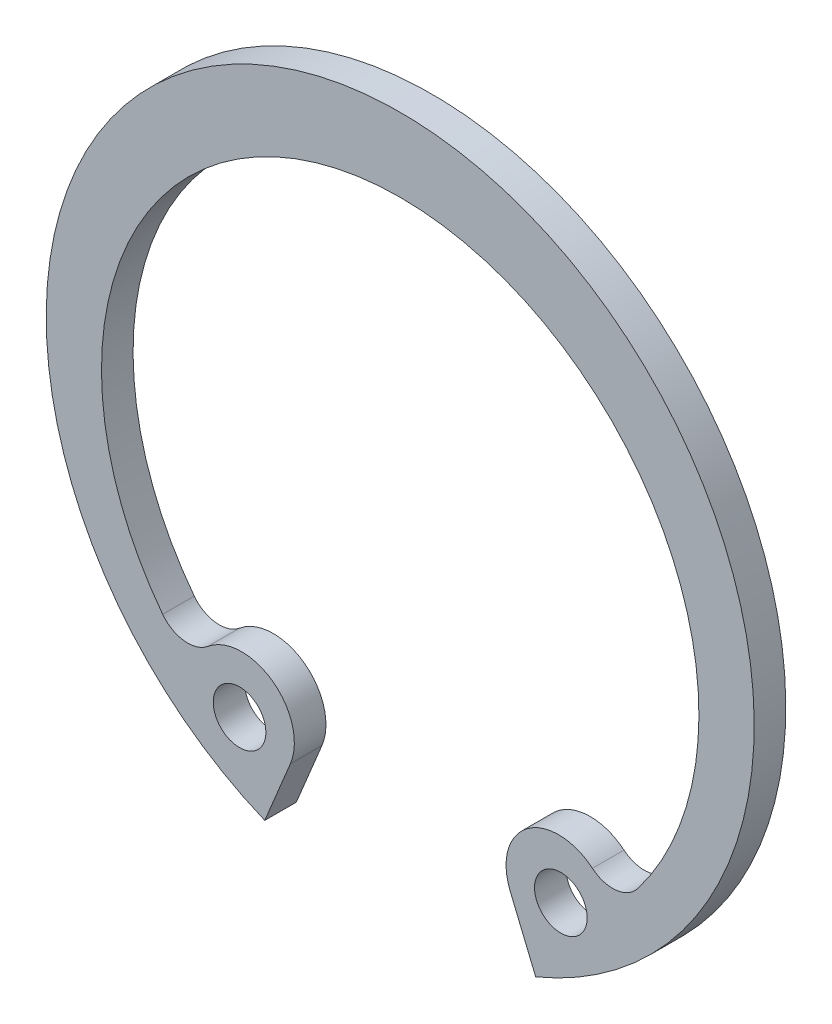
ISO-10303-21;
HEADER;
FILE_DESCRIPTION(('STEP AP214'),'2;1');
FILE_NAME('part.step','',(''),(''),'','','');
FILE_SCHEMA(('AUTOMOTIVE_DESIGN { 1 0 10303 214 1 1 1 1 }'));
ENDSEC;
DATA;
#1=APPLICATION_CONTEXT('core data for automotive mechanical design processes');
#2=APPLICATION_PROTOCOL_DEFINITION('international standard','automotive_design',2000,#1);
#3=PRODUCT_CONTEXT('',#1,'mechanical');
#4=PRODUCT('Part','Part','',(#3));
#5=PRODUCT_RELATED_PRODUCT_CATEGORY('part','',(#4));
#6=PRODUCT_DEFINITION_FORMATION('','',#4);
#7=PRODUCT_DEFINITION_CONTEXT('part definition',#1,'design');
#8=PRODUCT_DEFINITION('design','',#6,#7);
#9=PRODUCT_DEFINITION_SHAPE('','',#8);
#10=(LENGTH_UNIT() NAMED_UNIT(*) SI_UNIT(.MILLI.,.METRE.));
#11=(NAMED_UNIT(*) PLANE_ANGLE_UNIT() SI_UNIT($,.RADIAN.));
#12=(NAMED_UNIT(*) SI_UNIT($,.STERADIAN.) SOLID_ANGLE_UNIT());
#13=UNCERTAINTY_MEASURE_WITH_UNIT(LENGTH_MEASURE(1.E-05),#10,'distance_accuracy_value','');
#14=(GEOMETRIC_REPRESENTATION_CONTEXT(3) GLOBAL_UNCERTAINTY_ASSIGNED_CONTEXT((#13)) GLOBAL_UNIT_ASSIGNED_CONTEXT((#10,
#11,#12)) REPRESENTATION_CONTEXT('',''));
#15=CARTESIAN_POINT('',(0.,0.,0.));
#16=DIRECTION('',(0.,0.,1.));
#17=DIRECTION('',(1.,0.,0.));
#18=AXIS2_PLACEMENT_3D('',#15,#16,#17);
#19=CARTESIAN_POINT('',(-6.02213372534577,-9.31246505464869,1.2));
#20=DIRECTION('',(0.,0.,1.));
#21=DIRECTION('',(1.,0.,0.));
#22=AXIS2_PLACEMENT_3D('',#19,#20,#21);
#23=PLANE('',#22);
#24=CARTESIAN_POINT('',(-6.1038113576428,-9.5096523022827,1.2));
#25=DIRECTION('',(0.,0.,1.));
#26=DIRECTION('',(1.,0.,0.));
#27=AXIS2_PLACEMENT_3D('',#24,#25,#26);
#28=CIRCLE('',#27,1.);
#29=CARTESIAN_POINT('',(-5.1038113576428,-9.5096523022827,1.2));
#30=VERTEX_POINT('',#29);
#31=EDGE_CURVE('E142',#30,#30,#28,.T.);
#32=ORIENTED_EDGE('',*,*,#31,.F.);
#33=EDGE_LOOP('',(#32));
#34=FACE_BOUND('',#33,.T.);
#35=CARTESIAN_POINT('',(-6.02213372534577,-9.31246505464869,1.2));
#36=DIRECTION('',(0.,0.,1.));
#37=DIRECTION('',(1.,0.,0.));
#38=AXIS2_PLACEMENT_3D('',#35,#36,#37);
#39=CIRCLE('',#38,1.99999999999999);
#40=CARTESIAN_POINT('',(-4.17437466032321,-10.0778319193789,1.2));
#41=VERTEX_POINT('',#40);
#42=CARTESIAN_POINT('',(-7.30279298064297,-7.77626458862168,1.2));
#43=VERTEX_POINT('',#42);
#44=EDGE_CURVE('E155',#41,#43,#39,.T.);
#45=ORIENTED_EDGE('',*,*,#44,.T.);
#46=CARTESIAN_POINT('',(-8.07118853382129,-6.85454430900547,1.2));
#47=DIRECTION('',(0.,0.,-1.));
#48=DIRECTION('',(-1.,0.,0.));
#49=AXIS2_PLACEMENT_3D('',#46,#47,#48);
#50=CIRCLE('',#49,1.2);
#51=CARTESIAN_POINT('',(-9.02541772008587,-7.58217516327213,1.2));
#52=VERTEX_POINT('',#51);
#53=EDGE_CURVE('E101',#43,#52,#50,.T.);
#54=ORIENTED_EDGE('',*,*,#53,.T.);
#55=CARTESIAN_POINT('',(0.,-0.7,1.2));
#56=DIRECTION('',(0.,0.,-1.));
#57=DIRECTION('',(1.,0.,0.));
#58=AXIS2_PLACEMENT_3D('',#55,#56,#57);
#59=CIRCLE('',#58,11.35);
#60=CARTESIAN_POINT('',(9.02541772008588,-7.58217516327213,1.2));
#61=VERTEX_POINT('',#60);
#62=EDGE_CURVE('E170',#52,#61,#59,.T.);
#63=ORIENTED_EDGE('',*,*,#62,.T.);
#64=CARTESIAN_POINT('',(8.0711885338213,-6.85454430900547,1.2));
#65=DIRECTION('',(0.,0.,-1.));
#66=DIRECTION('',(1.,0.,0.));
#67=AXIS2_PLACEMENT_3D('',#64,#65,#66);
#68=CIRCLE('',#67,1.2);
#69=CARTESIAN_POINT('',(7.30279298064297,-7.77626458862168,1.2));
#70=VERTEX_POINT('',#69);
#71=EDGE_CURVE('E183',#61,#70,#68,.T.);
#72=ORIENTED_EDGE('',*,*,#71,.T.);
#73=CARTESIAN_POINT('',(6.02213372534578,-9.31246505464869,1.2));
#74=DIRECTION('',(0.,0.,1.));
#75=DIRECTION('',(-1.,0.,0.));
#76=AXIS2_PLACEMENT_3D('',#73,#74,#75);
#77=CIRCLE('',#76,1.99999999999999);
#78=CARTESIAN_POINT('',(4.17437466032322,-10.0778319193789,1.2));
#79=VERTEX_POINT('',#78);
#80=EDGE_CURVE('E120',#70,#79,#77,.T.);
#81=ORIENTED_EDGE('',*,*,#80,.T.);
#82=DIRECTION('',(0.382683432365096,-0.923879532511284,0.));
#83=VECTOR('',#82,1.);
#84=CARTESIAN_POINT('',(4.17437466032322,-10.0778319193789,1.2));
#85=LINE('',#84,#83);
#86=CARTESIAN_POINT('',(5.14709216531048,-12.4261797122768,1.2));
#87=VERTEX_POINT('',#86);
#88=EDGE_CURVE('E114',#79,#87,#85,.T.);
#89=ORIENTED_EDGE('',*,*,#88,.T.);
#90=CARTESIAN_POINT('',(0.,0.,1.2));
#91=DIRECTION('',(0.,0.,1.));
#92=DIRECTION('',(1.,0.,0.));
#93=AXIS2_PLACEMENT_3D('',#90,#91,#92);
#94=CIRCLE('',#93,13.45);
#95=CARTESIAN_POINT('',(-5.14709216531047,-12.4261797122768,1.2));
#96=VERTEX_POINT('',#95);
#97=EDGE_CURVE('E118',#87,#96,#94,.T.);
#98=ORIENTED_EDGE('',*,*,#97,.T.);
#99=DIRECTION('',(0.382683432365091,0.923879532511286,0.));
#100=VECTOR('',#99,1.);
#101=CARTESIAN_POINT('',(-4.17437466032321,-10.0778319193789,1.2));
#102=LINE('',#101,#100);
#103=EDGE_CURVE('E58',#96,#41,#102,.T.);
#104=ORIENTED_EDGE('',*,*,#103,.T.);
#105=EDGE_LOOP('',(#45,#54,#63,#72,#81,#89,#98,#104));
#106=FACE_BOUND('',#105,.T.);
#107=CARTESIAN_POINT('',(6.10381135764281,-9.5096523022827,1.2));
#108=DIRECTION('',(0.,0.,1.));
#109=DIRECTION('',(-1.,0.,0.));
#110=AXIS2_PLACEMENT_3D('',#107,#108,#109);
#111=CIRCLE('',#110,1.);
#112=CARTESIAN_POINT('',(5.10381135764281,-9.5096523022827,1.2));
#113=VERTEX_POINT('',#112);
#114=EDGE_CURVE('E193',#113,#113,#111,.T.);
#115=ORIENTED_EDGE('',*,*,#114,.F.);
#116=EDGE_LOOP('',(#115));
#117=FACE_BOUND('',#116,.T.);
#118=ADVANCED_FACE('F41',(#34,#106,#117),#23,.T.);
#119=CARTESIAN_POINT('',(-6.02213372534577,-9.31246505464869,0.));
#120=DIRECTION('',(0.,0.,1.));
#121=DIRECTION('',(1.,0.,0.));
#122=AXIS2_PLACEMENT_3D('',#119,#120,#121);
#123=PLANE('',#122);
#124=CARTESIAN_POINT('',(-6.02213372534577,-9.31246505464869,0.));
#125=DIRECTION('',(0.,0.,1.));
#126=DIRECTION('',(1.,0.,0.));
#127=AXIS2_PLACEMENT_3D('',#124,#125,#126);
#128=CIRCLE('',#127,1.99999999999999);
#129=CARTESIAN_POINT('',(-4.17437466032321,-10.0778319193789,0.));
#130=VERTEX_POINT('',#129);
#131=CARTESIAN_POINT('',(-7.30279298064297,-7.77626458862168,0.));
#132=VERTEX_POINT('',#131);
#133=EDGE_CURVE('E138',#130,#132,#128,.T.);
#134=ORIENTED_EDGE('',*,*,#133,.F.);
#135=DIRECTION('',(0.382683432365091,0.923879532511286,0.));
#136=VECTOR('',#135,1.);
#137=CARTESIAN_POINT('',(-4.17437466032321,-10.0778319193789,0.));
#138=LINE('',#137,#136);
#139=CARTESIAN_POINT('',(-5.14709216531047,-12.4261797122768,0.));
#140=VERTEX_POINT('',#139);
#141=EDGE_CURVE('E93',#140,#130,#138,.T.);
#142=ORIENTED_EDGE('',*,*,#141,.F.);
#143=CARTESIAN_POINT('',(0.,0.,0.));
#144=DIRECTION('',(0.,0.,1.));
#145=DIRECTION('',(1.,0.,0.));
#146=AXIS2_PLACEMENT_3D('',#143,#144,#145);
#147=CIRCLE('',#146,13.45);
#148=CARTESIAN_POINT('',(5.14709216531048,-12.4261797122768,0.));
#149=VERTEX_POINT('',#148);
#150=EDGE_CURVE('E87',#149,#140,#147,.T.);
#151=ORIENTED_EDGE('',*,*,#150,.F.);
#152=DIRECTION('',(0.382683432365096,-0.923879532511284,0.));
#153=VECTOR('',#152,1.);
#154=CARTESIAN_POINT('',(4.17437466032322,-10.0778319193789,0.));
#155=LINE('',#154,#153);
#156=CARTESIAN_POINT('',(4.17437466032322,-10.0778319193789,0.));
#157=VERTEX_POINT('',#156);
#158=EDGE_CURVE('E128',#157,#149,#155,.T.);
#159=ORIENTED_EDGE('',*,*,#158,.F.);
#160=CARTESIAN_POINT('',(6.02213372534578,-9.31246505464869,0.));
#161=DIRECTION('',(0.,0.,1.));
#162=DIRECTION('',(-1.,0.,0.));
#163=AXIS2_PLACEMENT_3D('',#160,#161,#162);
#164=CIRCLE('',#163,1.99999999999999);
#165=CARTESIAN_POINT('',(7.30279298064297,-7.77626458862168,0.));
#166=VERTEX_POINT('',#165);
#167=EDGE_CURVE('E149',#166,#157,#164,.T.);
#168=ORIENTED_EDGE('',*,*,#167,.F.);
#169=CARTESIAN_POINT('',(8.0711885338213,-6.85454430900547,0.));
#170=DIRECTION('',(0.,0.,-1.));
#171=DIRECTION('',(1.,0.,0.));
#172=AXIS2_PLACEMENT_3D('',#169,#170,#171);
#173=CIRCLE('',#172,1.2);
#174=CARTESIAN_POINT('',(9.02541772008588,-7.58217516327213,0.));
#175=VERTEX_POINT('',#174);
#176=EDGE_CURVE('E147',#175,#166,#173,.T.);
#177=ORIENTED_EDGE('',*,*,#176,.F.);
#178=CARTESIAN_POINT('',(0.,-0.7,0.));
#179=DIRECTION('',(0.,0.,-1.));
#180=DIRECTION('',(1.,0.,0.));
#181=AXIS2_PLACEMENT_3D('',#178,#179,#180);
#182=CIRCLE('',#181,11.35);
#183=CARTESIAN_POINT('',(-9.02541772008587,-7.58217516327213,0.));
#184=VERTEX_POINT('',#183);
#185=EDGE_CURVE('E144',#184,#175,#182,.T.);
#186=ORIENTED_EDGE('',*,*,#185,.F.);
#187=CARTESIAN_POINT('',(-8.07118853382129,-6.85454430900547,0.));
#188=DIRECTION('',(0.,0.,-1.));
#189=DIRECTION('',(-1.,0.,0.));
#190=AXIS2_PLACEMENT_3D('',#187,#188,#189);
#191=CIRCLE('',#190,1.2);
#192=EDGE_CURVE('E141',#132,#184,#191,.T.);
#193=ORIENTED_EDGE('',*,*,#192,.F.);
#194=EDGE_LOOP('',(#134,#142,#151,#159,#168,#177,#186,#193));
#195=FACE_BOUND('',#194,.T.);
#196=CARTESIAN_POINT('',(-6.1038113576428,-9.5096523022827,0.));
#197=DIRECTION('',(0.,0.,1.));
#198=DIRECTION('',(1.,0.,0.));
#199=AXIS2_PLACEMENT_3D('',#196,#197,#198);
#200=CIRCLE('',#199,1.);
#201=CARTESIAN_POINT('',(-5.1038113576428,-9.5096523022827,0.));
#202=VERTEX_POINT('',#201);
#203=EDGE_CURVE('E190',#202,#202,#200,.T.);
#204=ORIENTED_EDGE('',*,*,#203,.T.);
#205=EDGE_LOOP('',(#204));
#206=FACE_BOUND('',#205,.T.);
#207=CARTESIAN_POINT('',(6.10381135764281,-9.5096523022827,0.));
#208=DIRECTION('',(0.,0.,1.));
#209=DIRECTION('',(-1.,0.,0.));
#210=AXIS2_PLACEMENT_3D('',#207,#208,#209);
#211=CIRCLE('',#210,1.);
#212=CARTESIAN_POINT('',(5.10381135764281,-9.5096523022827,0.));
#213=VERTEX_POINT('',#212);
#214=EDGE_CURVE('E196',#213,#213,#211,.T.);
#215=ORIENTED_EDGE('',*,*,#214,.T.);
#216=EDGE_LOOP('',(#215));
#217=FACE_BOUND('',#216,.T.);
#218=ADVANCED_FACE('F174',(#195,#206,#217),#123,.F.);
#219=CARTESIAN_POINT('',(-6.02213372534577,-9.31246505464869,1.2));
#220=DIRECTION('',(0.,0.,-1.));
#221=DIRECTION('',(-1.,0.,0.));
#222=AXIS2_PLACEMENT_3D('',#219,#220,#221);
#223=CYLINDRICAL_SURFACE('',#222,1.99999999999999);
#224=ORIENTED_EDGE('',*,*,#133,.T.);
#225=DIRECTION('',(0.,0.,-1.));
#226=VECTOR('',#225,1.);
#227=CARTESIAN_POINT('',(-7.30279298064297,-7.77626458862168,1.2));
#228=LINE('',#227,#226);
#229=EDGE_CURVE('E11',#43,#132,#228,.T.);
#230=ORIENTED_EDGE('',*,*,#229,.F.);
#231=ORIENTED_EDGE('',*,*,#44,.F.);
#232=DIRECTION('',(0.,0.,-1.));
#233=VECTOR('',#232,1.);
#234=CARTESIAN_POINT('',(-4.17437466032321,-10.0778319193789,1.2));
#235=LINE('',#234,#233);
#236=EDGE_CURVE('E134',#41,#130,#235,.T.);
#237=ORIENTED_EDGE('',*,*,#236,.T.);
#238=EDGE_LOOP('',(#224,#230,#231,#237));
#239=FACE_BOUND('',#238,.T.);
#240=ADVANCED_FACE('F43',(#239),#223,.T.);
#241=CARTESIAN_POINT('',(-8.07118853382129,-6.85454430900547,1.2));
#242=DIRECTION('',(0.,0.,-1.));
#243=DIRECTION('',(-1.,0.,0.));
#244=AXIS2_PLACEMENT_3D('',#241,#242,#243);
#245=CYLINDRICAL_SURFACE('',#244,1.2);
#246=ORIENTED_EDGE('',*,*,#192,.T.);
#247=DIRECTION('',(0.,0.,-1.));
#248=VECTOR('',#247,1.);
#249=CARTESIAN_POINT('',(-9.02541772008587,-7.58217516327213,1.2));
#250=LINE('',#249,#248);
#251=EDGE_CURVE('E50',#52,#184,#250,.T.);
#252=ORIENTED_EDGE('',*,*,#251,.F.);
#253=ORIENTED_EDGE('',*,*,#53,.F.);
#254=ORIENTED_EDGE('',*,*,#229,.T.);
#255=EDGE_LOOP('',(#246,#252,#253,#254));
#256=FACE_BOUND('',#255,.T.);
#257=ADVANCED_FACE('F228',(#256),#245,.F.);
#258=CARTESIAN_POINT('',(0.,-0.7,1.2));
#259=DIRECTION('',(0.,0.,-1.));
#260=DIRECTION('',(-1.,0.,0.));
#261=AXIS2_PLACEMENT_3D('',#258,#259,#260);
#262=CYLINDRICAL_SURFACE('',#261,11.35);
#263=ORIENTED_EDGE('',*,*,#185,.T.);
#264=DIRECTION('',(0.,0.,-1.));
#265=VECTOR('',#264,1.);
#266=CARTESIAN_POINT('',(9.02541772008588,-7.58217516327213,1.2));
#267=LINE('',#266,#265);
#268=EDGE_CURVE('E162',#61,#175,#267,.T.);
#269=ORIENTED_EDGE('',*,*,#268,.F.);
#270=ORIENTED_EDGE('',*,*,#62,.F.);
#271=ORIENTED_EDGE('',*,*,#251,.T.);
#272=EDGE_LOOP('',(#263,#269,#270,#271));
#273=FACE_BOUND('',#272,.T.);
#274=ADVANCED_FACE('F168',(#273),#262,.F.);
#275=CARTESIAN_POINT('',(8.0711885338213,-6.85454430900547,1.2));
#276=DIRECTION('',(0.,0.,-1.));
#277=DIRECTION('',(-1.,0.,0.));
#278=AXIS2_PLACEMENT_3D('',#275,#276,#277);
#279=CYLINDRICAL_SURFACE('',#278,1.2);
#280=ORIENTED_EDGE('',*,*,#176,.T.);
#281=DIRECTION('',(0.,0.,-1.));
#282=VECTOR('',#281,1.);
#283=CARTESIAN_POINT('',(7.30279298064297,-7.77626458862168,1.2));
#284=LINE('',#283,#282);
#285=EDGE_CURVE('E159',#70,#166,#284,.T.);
#286=ORIENTED_EDGE('',*,*,#285,.F.);
#287=ORIENTED_EDGE('',*,*,#71,.F.);
#288=ORIENTED_EDGE('',*,*,#268,.T.);
#289=EDGE_LOOP('',(#280,#286,#287,#288));
#290=FACE_BOUND('',#289,.T.);
#291=ADVANCED_FACE('F179',(#290),#279,.F.);
#292=CARTESIAN_POINT('',(6.02213372534578,-9.31246505464869,1.2));
#293=DIRECTION('',(0.,0.,-1.));
#294=DIRECTION('',(-1.,0.,0.));
#295=AXIS2_PLACEMENT_3D('',#292,#293,#294);
#296=CYLINDRICAL_SURFACE('',#295,1.99999999999999);
#297=ORIENTED_EDGE('',*,*,#167,.T.);
#298=DIRECTION('',(0.,0.,-1.));
#299=VECTOR('',#298,1.);
#300=CARTESIAN_POINT('',(4.17437466032322,-10.0778319193789,1.2));
#301=LINE('',#300,#299);
#302=EDGE_CURVE('E129',#79,#157,#301,.T.);
#303=ORIENTED_EDGE('',*,*,#302,.F.);
#304=ORIENTED_EDGE('',*,*,#80,.F.);
#305=ORIENTED_EDGE('',*,*,#285,.T.);
#306=EDGE_LOOP('',(#297,#303,#304,#305));
#307=FACE_BOUND('',#306,.T.);
#308=ADVANCED_FACE('F182',(#307),#296,.T.);
#309=CARTESIAN_POINT('',(4.17437466032322,-10.0778319193789,1.2));
#310=DIRECTION('',(0.923879532511284,0.382683432365096,0.));
#311=DIRECTION('',(-0.382683432365096,0.923879532511284,0.));
#312=AXIS2_PLACEMENT_3D('',#309,#310,#311);
#313=PLANE('',#312);
#314=ORIENTED_EDGE('',*,*,#158,.T.);
#315=DIRECTION('',(0.,0.,-1.));
#316=VECTOR('',#315,1.);
#317=CARTESIAN_POINT('',(5.14709216531048,-12.4261797122768,1.2));
#318=LINE('',#317,#316);
#319=EDGE_CURVE('E125',#87,#149,#318,.T.);
#320=ORIENTED_EDGE('',*,*,#319,.F.);
#321=ORIENTED_EDGE('',*,*,#88,.F.);
#322=ORIENTED_EDGE('',*,*,#302,.T.);
#323=EDGE_LOOP('',(#314,#320,#321,#322));
#324=FACE_BOUND('',#323,.T.);
#325=ADVANCED_FACE('F126',(#324),#313,.F.);
#326=CARTESIAN_POINT('',(0.,0.,1.2));
#327=DIRECTION('',(0.,0.,-1.));
#328=DIRECTION('',(-1.,0.,0.));
#329=AXIS2_PLACEMENT_3D('',#326,#327,#328);
#330=CYLINDRICAL_SURFACE('',#329,13.45);
#331=ORIENTED_EDGE('',*,*,#150,.T.);
#332=DIRECTION('',(0.,0.,-1.));
#333=VECTOR('',#332,1.);
#334=CARTESIAN_POINT('',(-5.14709216531047,-12.4261797122768,1.2));
#335=LINE('',#334,#333);
#336=EDGE_CURVE('E130',#96,#140,#335,.T.);
#337=ORIENTED_EDGE('',*,*,#336,.F.);
#338=ORIENTED_EDGE('',*,*,#97,.F.);
#339=ORIENTED_EDGE('',*,*,#319,.T.);
#340=EDGE_LOOP('',(#331,#337,#338,#339));
#341=FACE_BOUND('',#340,.T.);
#342=ADVANCED_FACE('F132',(#341),#330,.T.);
#343=CARTESIAN_POINT('',(-4.17437466032321,-10.0778319193789,1.2));
#344=DIRECTION('',(-0.923879532511286,0.382683432365091,0.));
#345=DIRECTION('',(-0.382683432365091,-0.923879532511287,0.));
#346=AXIS2_PLACEMENT_3D('',#343,#344,#345);
#347=PLANE('',#346);
#348=ORIENTED_EDGE('',*,*,#141,.T.);
#349=ORIENTED_EDGE('',*,*,#236,.F.);
#350=ORIENTED_EDGE('',*,*,#103,.F.);
#351=ORIENTED_EDGE('',*,*,#336,.T.);
#352=EDGE_LOOP('',(#348,#349,#350,#351));
#353=FACE_BOUND('',#352,.T.);
#354=ADVANCED_FACE('F216',(#353),#347,.F.);
#355=CARTESIAN_POINT('',(-6.1038113576428,-9.5096523022827,1.2));
#356=DIRECTION('',(0.,0.,-1.));
#357=DIRECTION('',(-1.,0.,0.));
#358=AXIS2_PLACEMENT_3D('',#355,#356,#357);
#359=CYLINDRICAL_SURFACE('',#358,1.);
#360=ORIENTED_EDGE('',*,*,#31,.T.);
#361=EDGE_LOOP('',(#360));
#362=FACE_BOUND('',#361,.T.);
#363=ORIENTED_EDGE('',*,*,#203,.F.);
#364=EDGE_LOOP('',(#363));
#365=FACE_BOUND('',#364,.T.);
#366=ADVANCED_FACE('F213',(#362,#365),#359,.F.);
#367=CARTESIAN_POINT('',(6.10381135764281,-9.5096523022827,1.2));
#368=DIRECTION('',(0.,0.,-1.));
#369=DIRECTION('',(-1.,0.,0.));
#370=AXIS2_PLACEMENT_3D('',#367,#368,#369);
#371=CYLINDRICAL_SURFACE('',#370,1.);
#372=ORIENTED_EDGE('',*,*,#114,.T.);
#373=EDGE_LOOP('',(#372));
#374=FACE_BOUND('',#373,.T.);
#375=ORIENTED_EDGE('',*,*,#214,.F.);
#376=EDGE_LOOP('',(#375));
#377=FACE_BOUND('',#376,.T.);
#378=ADVANCED_FACE('F202',(#374,#377),#371,.F.);
#379=CLOSED_SHELL('',(#118,#218,#240,#257,#274,#291,#308,#325,#342,#354,#366,#378));
#380=MANIFOLD_SOLID_BREP('B2',#379);
#381=ADVANCED_BREP_SHAPE_REPRESENTATION('',(#18,#380),#14);
#382=SHAPE_DEFINITION_REPRESENTATION(#9,#381);
ENDSEC;
END-ISO-10303-21;
